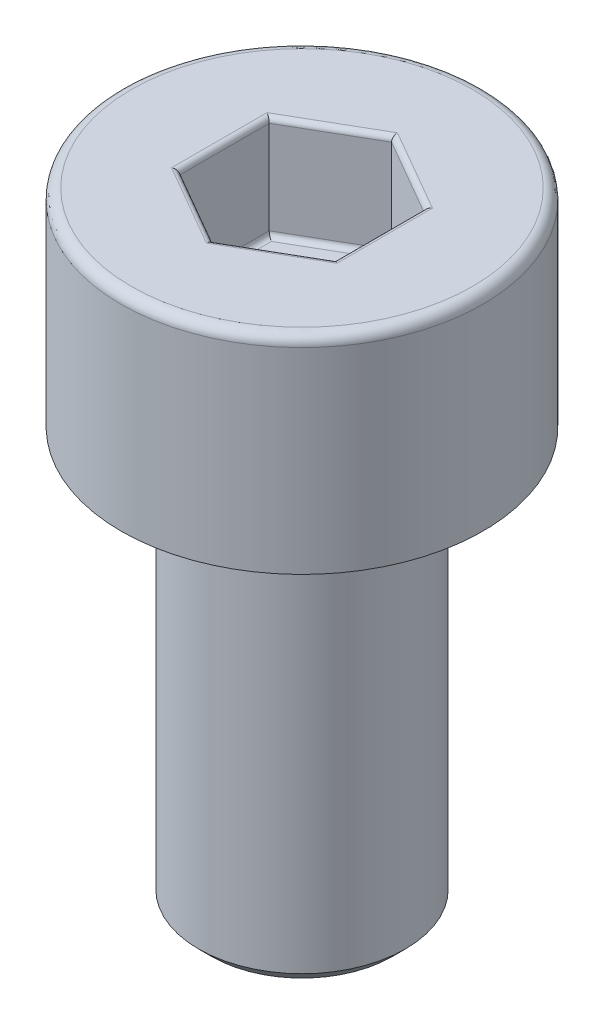
ISO-10303-21;
HEADER;
FILE_DESCRIPTION(('STEP AP214'),'2;1');
FILE_NAME('part.step','',(''),(''),'','','');
FILE_SCHEMA(('AUTOMOTIVE_DESIGN { 1 0 10303 214 1 1 1 1 }'));
ENDSEC;
DATA;
#1=APPLICATION_CONTEXT('core data for automotive mechanical design processes');
#2=APPLICATION_PROTOCOL_DEFINITION('international standard','automotive_design',2000,#1);
#3=PRODUCT_CONTEXT('',#1,'mechanical');
#4=PRODUCT('Part','Part','',(#3));
#5=PRODUCT_RELATED_PRODUCT_CATEGORY('part','',(#4));
#6=PRODUCT_DEFINITION_FORMATION('','',#4);
#7=PRODUCT_DEFINITION_CONTEXT('part definition',#1,'design');
#8=PRODUCT_DEFINITION('design','',#6,#7);
#9=PRODUCT_DEFINITION_SHAPE('','',#8);
#10=(LENGTH_UNIT() NAMED_UNIT(*) SI_UNIT(.MILLI.,.METRE.));
#11=(NAMED_UNIT(*) PLANE_ANGLE_UNIT() SI_UNIT($,.RADIAN.));
#12=(NAMED_UNIT(*) SI_UNIT($,.STERADIAN.) SOLID_ANGLE_UNIT());
#13=UNCERTAINTY_MEASURE_WITH_UNIT(LENGTH_MEASURE(1.E-05),#10,'distance_accuracy_value','');
#14=(GEOMETRIC_REPRESENTATION_CONTEXT(3) GLOBAL_UNCERTAINTY_ASSIGNED_CONTEXT((#13)) GLOBAL_UNIT_ASSIGNED_CONTEXT((#10,
#11,#12)) REPRESENTATION_CONTEXT('',''));
#15=CARTESIAN_POINT('',(0.,0.,0.));
#16=DIRECTION('',(0.,0.,1.));
#17=DIRECTION('',(1.,0.,0.));
#18=AXIS2_PLACEMENT_3D('',#15,#16,#17);
#19=CARTESIAN_POINT('',(0.,-12.,0.));
#20=DIRECTION('',(0.,-1.,0.));
#21=DIRECTION('',(0.,0.,-1.));
#22=AXIS2_PLACEMENT_3D('',#19,#20,#21);
#23=PLANE('',#22);
#24=CARTESIAN_POINT('',(0.,-12.,0.));
#25=DIRECTION('',(0.,-1.,0.));
#26=DIRECTION('',(0.,0.,-1.));
#27=AXIS2_PLACEMENT_3D('',#24,#25,#26);
#28=CIRCLE('',#27,1.74999999999999);
#29=CARTESIAN_POINT('',(0.,-12.,-1.74999999999999));
#30=VERTEX_POINT('',#29);
#31=EDGE_CURVE('E261',#30,#30,#28,.T.);
#32=ORIENTED_EDGE('',*,*,#31,.T.);
#33=EDGE_LOOP('',(#32));
#34=FACE_BOUND('',#33,.T.);
#35=ADVANCED_FACE('F33',(#34),#23,.T.);
#36=CARTESIAN_POINT('',(0.,0.,0.));
#37=DIRECTION('',(0.,1.,0.));
#38=DIRECTION('',(0.,0.,1.));
#39=AXIS2_PLACEMENT_3D('',#36,#37,#38);
#40=CYLINDRICAL_SURFACE('',#39,2.);
#41=CARTESIAN_POINT('',(0.,-4.24999999999999,0.));
#42=DIRECTION('',(0.,-1.,0.));
#43=DIRECTION('',(0.,0.,-1.));
#44=AXIS2_PLACEMENT_3D('',#41,#42,#43);
#45=CIRCLE('',#44,2.);
#46=CARTESIAN_POINT('',(0.,-4.24999999999999,-2.));
#47=VERTEX_POINT('',#46);
#48=EDGE_CURVE('E258',#47,#47,#45,.T.);
#49=ORIENTED_EDGE('',*,*,#48,.T.);
#50=EDGE_LOOP('',(#49));
#51=FACE_BOUND('',#50,.T.);
#52=CARTESIAN_POINT('',(0.,-11.75,0.));
#53=DIRECTION('',(0.,-1.,0.));
#54=DIRECTION('',(0.,0.,-1.));
#55=AXIS2_PLACEMENT_3D('',#52,#53,#54);
#56=CIRCLE('',#55,2.);
#57=CARTESIAN_POINT('',(0.,-11.75,-2.));
#58=VERTEX_POINT('',#57);
#59=EDGE_CURVE('E255',#58,#58,#56,.F.);
#60=ORIENTED_EDGE('',*,*,#59,.T.);
#61=EDGE_LOOP('',(#60));
#62=FACE_BOUND('',#61,.T.);
#63=ADVANCED_FACE('F287',(#51,#62),#40,.T.);
#64=CARTESIAN_POINT('',(-2.,-4.,0.));
#65=DIRECTION('',(0.,-1.,0.));
#66=DIRECTION('',(0.,0.,-1.));
#67=AXIS2_PLACEMENT_3D('',#64,#65,#66);
#68=PLANE('',#67);
#69=CARTESIAN_POINT('',(0.,-4.,0.));
#70=DIRECTION('',(0.,-1.,0.));
#71=DIRECTION('',(0.,0.,-1.));
#72=AXIS2_PLACEMENT_3D('',#69,#70,#71);
#73=CIRCLE('',#72,2.24999999999999);
#74=CARTESIAN_POINT('',(0.,-4.,-2.24999999999999));
#75=VERTEX_POINT('',#74);
#76=EDGE_CURVE('E252',#75,#75,#73,.F.);
#77=ORIENTED_EDGE('',*,*,#76,.T.);
#78=EDGE_LOOP('',(#77));
#79=FACE_BOUND('',#78,.T.);
#80=CARTESIAN_POINT('',(0.,-4.,0.));
#81=DIRECTION('',(0.,1.,0.));
#82=DIRECTION('',(0.,0.,1.));
#83=AXIS2_PLACEMENT_3D('',#80,#81,#82);
#84=CIRCLE('',#83,3.5);
#85=CARTESIAN_POINT('',(0.,-4.,3.5));
#86=VERTEX_POINT('',#85);
#87=EDGE_CURVE('E249',#86,#86,#84,.T.);
#88=ORIENTED_EDGE('',*,*,#87,.F.);
#89=EDGE_LOOP('',(#88));
#90=FACE_BOUND('',#89,.T.);
#91=ADVANCED_FACE('F293',(#79,#90),#68,.T.);
#92=CARTESIAN_POINT('',(0.,0.,0.));
#93=DIRECTION('',(0.,1.,0.));
#94=DIRECTION('',(0.,0.,1.));
#95=AXIS2_PLACEMENT_3D('',#92,#93,#94);
#96=CYLINDRICAL_SURFACE('',#95,3.5);
#97=CARTESIAN_POINT('',(0.,-0.2,0.));
#98=DIRECTION('',(0.,1.,0.));
#99=DIRECTION('',(0.,0.,1.));
#100=AXIS2_PLACEMENT_3D('',#97,#98,#99);
#101=CIRCLE('',#100,3.5);
#102=CARTESIAN_POINT('',(0.,-0.2,3.5));
#103=VERTEX_POINT('',#102);
#104=EDGE_CURVE('E159',#103,#103,#101,.F.);
#105=ORIENTED_EDGE('',*,*,#104,.T.);
#106=EDGE_LOOP('',(#105));
#107=FACE_BOUND('',#106,.T.);
#108=ORIENTED_EDGE('',*,*,#87,.T.);
#109=EDGE_LOOP('',(#108));
#110=FACE_BOUND('',#109,.T.);
#111=ADVANCED_FACE('F303',(#107,#110),#96,.T.);
#112=CARTESIAN_POINT('',(-3.5,0.,0.));
#113=DIRECTION('',(0.,1.,0.));
#114=DIRECTION('',(0.,0.,1.));
#115=AXIS2_PLACEMENT_3D('',#112,#113,#114);
#116=PLANE('',#115);
#117=DIRECTION('',(0.,0.,1.));
#118=VECTOR('',#117,1.);
#119=CARTESIAN_POINT('',(-1.6,0.,-0.86602540378444));
#120=LINE('',#119,#118);
#121=CARTESIAN_POINT('',(-1.6,0.,0.923760430703401));
#122=VERTEX_POINT('',#121);
#123=CARTESIAN_POINT('',(-1.6,0.,-0.923760430703403));
#124=VERTEX_POINT('',#123);
#125=EDGE_CURVE('E175',#122,#124,#120,.F.);
#126=ORIENTED_EDGE('',*,*,#125,.T.);
#127=DIRECTION('',(-0.866025403784439,0.,0.5));
#128=VECTOR('',#127,1.);
#129=CARTESIAN_POINT('',(-0.0499999999999999,0.,-1.81865334794732));
#130=LINE('',#129,#128);
#131=CARTESIAN_POINT('',(0.,0.,-1.8475208614068));
#132=VERTEX_POINT('',#131);
#133=EDGE_CURVE('E134',#124,#132,#130,.F.);
#134=ORIENTED_EDGE('',*,*,#133,.T.);
#135=DIRECTION('',(-0.866025403784439,0.,-0.5));
#136=VECTOR('',#135,1.);
#137=CARTESIAN_POINT('',(1.55,0.,-0.952627944162884));
#138=LINE('',#137,#136);
#139=CARTESIAN_POINT('',(1.6,0.,-0.923760430703403));
#140=VERTEX_POINT('',#139);
#141=EDGE_CURVE('E161',#132,#140,#138,.F.);
#142=ORIENTED_EDGE('',*,*,#141,.T.);
#143=DIRECTION('',(0.,0.,-1.));
#144=VECTOR('',#143,1.);
#145=CARTESIAN_POINT('',(1.6,0.,0.866025403784439));
#146=LINE('',#145,#144);
#147=CARTESIAN_POINT('',(1.6,0.,0.923760430703402));
#148=VERTEX_POINT('',#147);
#149=EDGE_CURVE('E169',#140,#148,#146,.F.);
#150=ORIENTED_EDGE('',*,*,#149,.T.);
#151=DIRECTION('',(0.866025403784439,0.,-0.5));
#152=VECTOR('',#151,1.);
#153=CARTESIAN_POINT('',(0.0499999999999988,0.,1.81865334794732));
#154=LINE('',#153,#152);
#155=CARTESIAN_POINT('',(0.,0.,1.8475208614068));
#156=VERTEX_POINT('',#155);
#157=EDGE_CURVE('E171',#148,#156,#154,.F.);
#158=ORIENTED_EDGE('',*,*,#157,.T.);
#159=DIRECTION('',(0.866025403784439,0.,0.5));
#160=VECTOR('',#159,1.);
#161=CARTESIAN_POINT('',(-1.55,0.,0.952627944162882));
#162=LINE('',#161,#160);
#163=EDGE_CURVE('E173',#156,#122,#162,.F.);
#164=ORIENTED_EDGE('',*,*,#163,.T.);
#165=EDGE_LOOP('',(#126,#134,#142,#150,#158,#164));
#166=FACE_BOUND('',#165,.T.);
#167=CARTESIAN_POINT('',(0.,0.,0.));
#168=DIRECTION('',(0.,1.,0.));
#169=DIRECTION('',(0.,0.,1.));
#170=AXIS2_PLACEMENT_3D('',#167,#168,#169);
#171=CIRCLE('',#170,3.3);
#172=CARTESIAN_POINT('',(0.,0.,3.3));
#173=VERTEX_POINT('',#172);
#174=EDGE_CURVE('E164',#173,#173,#171,.T.);
#175=ORIENTED_EDGE('',*,*,#174,.T.);
#176=EDGE_LOOP('',(#175));
#177=FACE_BOUND('',#176,.T.);
#178=ADVANCED_FACE('F266',(#166,#177),#116,.T.);
#179=CARTESIAN_POINT('',(0.,-4.,0.));
#180=DIRECTION('',(0.,1.,0.));
#181=DIRECTION('',(0.,0.,1.));
#182=AXIS2_PLACEMENT_3D('',#179,#180,#181);
#183=CONICAL_SURFACE('',#182,2.24999999999999,0.785398163397457);
#184=ORIENTED_EDGE('',*,*,#48,.F.);
#185=EDGE_LOOP('',(#184));
#186=FACE_BOUND('',#185,.T.);
#187=ORIENTED_EDGE('',*,*,#76,.F.);
#188=EDGE_LOOP('',(#187));
#189=FACE_BOUND('',#188,.T.);
#190=ADVANCED_FACE('F281',(#186,#189),#183,.T.);
#191=CARTESIAN_POINT('',(0.,-11.75,0.));
#192=DIRECTION('',(0.,1.,0.));
#193=DIRECTION('',(0.,0.,1.));
#194=AXIS2_PLACEMENT_3D('',#191,#192,#193);
#195=CONICAL_SURFACE('',#194,2.,0.785398163397453);
#196=ORIENTED_EDGE('',*,*,#31,.F.);
#197=EDGE_LOOP('',(#196));
#198=FACE_BOUND('',#197,.T.);
#199=ORIENTED_EDGE('',*,*,#59,.F.);
#200=EDGE_LOOP('',(#199));
#201=FACE_BOUND('',#200,.T.);
#202=ADVANCED_FACE('F271',(#198,#201),#195,.T.);
#203=CARTESIAN_POINT('',(0.,-0.2,0.));
#204=DIRECTION('',(0.,1.,0.));
#205=DIRECTION('',(0.,0.,1.));
#206=AXIS2_PLACEMENT_3D('',#203,#204,#205);
#207=TOROIDAL_SURFACE('',#206,3.3,0.2);
#208=ORIENTED_EDGE('',*,*,#104,.F.);
#209=EDGE_LOOP('',(#208));
#210=FACE_BOUND('',#209,.T.);
#211=ORIENTED_EDGE('',*,*,#174,.F.);
#212=EDGE_LOOP('',(#211));
#213=FACE_BOUND('',#212,.T.);
#214=ADVANCED_FACE('F268',(#210,#213),#207,.T.);
#215=CARTESIAN_POINT('',(1.5,-2.,-0.86602540378444));
#216=DIRECTION('',(0.5,0.,-0.866025403784439));
#217=DIRECTION('',(-0.866025403784439,0.,-0.5));
#218=AXIS2_PLACEMENT_3D('',#215,#216,#217);
#219=PLANE('',#218);
#220=DIRECTION('',(0.,1.,0.));
#221=VECTOR('',#220,1.);
#222=CARTESIAN_POINT('',(1.5,-2.,-0.86602540378444));
#223=LINE('',#222,#221);
#224=CARTESIAN_POINT('',(1.5,-1.9,-0.86602540378444));
#225=VERTEX_POINT('',#224);
#226=CARTESIAN_POINT('',(1.5,-0.1,-0.86602540378444));
#227=VERTEX_POINT('',#226);
#228=EDGE_CURVE('E243',#225,#227,#223,.T.);
#229=ORIENTED_EDGE('',*,*,#228,.T.);
#230=DIRECTION('',(-0.866025403784439,0.,-0.5));
#231=VECTOR('',#230,1.);
#232=CARTESIAN_POINT('',(0.,-0.1,-1.73205080756888));
#233=LINE('',#232,#231);
#234=CARTESIAN_POINT('',(0.,-0.1,-1.73205080756888));
#235=VERTEX_POINT('',#234);
#236=EDGE_CURVE('E195',#227,#235,#233,.T.);
#237=ORIENTED_EDGE('',*,*,#236,.T.);
#238=DIRECTION('',(0.,1.,0.));
#239=VECTOR('',#238,1.);
#240=CARTESIAN_POINT('',(0.,-2.,-1.73205080756888));
#241=LINE('',#240,#239);
#242=CARTESIAN_POINT('',(0.,-1.9,-1.73205080756888));
#243=VERTEX_POINT('',#242);
#244=EDGE_CURVE('E145',#243,#235,#241,.T.);
#245=ORIENTED_EDGE('',*,*,#244,.F.);
#246=DIRECTION('',(-0.866025403784439,0.,-0.5));
#247=VECTOR('',#246,1.);
#248=CARTESIAN_POINT('',(1.5,-1.9,-0.86602540378444));
#249=LINE('',#248,#247);
#250=EDGE_CURVE('E193',#243,#225,#249,.F.);
#251=ORIENTED_EDGE('',*,*,#250,.T.);
#252=EDGE_LOOP('',(#229,#237,#245,#251));
#253=FACE_BOUND('',#252,.T.);
#254=ADVANCED_FACE('F270',(#253),#219,.F.);
#255=CARTESIAN_POINT('',(1.5,-2.,0.866025403784439));
#256=DIRECTION('',(1.,0.,0.));
#257=DIRECTION('',(0.,0.,-1.));
#258=AXIS2_PLACEMENT_3D('',#255,#256,#257);
#259=PLANE('',#258);
#260=DIRECTION('',(0.,1.,0.));
#261=VECTOR('',#260,1.);
#262=CARTESIAN_POINT('',(1.5,-2.,0.866025403784439));
#263=LINE('',#262,#261);
#264=CARTESIAN_POINT('',(1.5,-1.9,0.866025403784439));
#265=VERTEX_POINT('',#264);
#266=CARTESIAN_POINT('',(1.5,-0.1,0.866025403784439));
#267=VERTEX_POINT('',#266);
#268=EDGE_CURVE('E240',#265,#267,#263,.T.);
#269=ORIENTED_EDGE('',*,*,#268,.T.);
#270=DIRECTION('',(0.,0.,-1.));
#271=VECTOR('',#270,1.);
#272=CARTESIAN_POINT('',(1.5,-0.1,-0.86602540378444));
#273=LINE('',#272,#271);
#274=EDGE_CURVE('E191',#267,#227,#273,.T.);
#275=ORIENTED_EDGE('',*,*,#274,.T.);
#276=ORIENTED_EDGE('',*,*,#228,.F.);
#277=DIRECTION('',(0.,0.,-1.));
#278=VECTOR('',#277,1.);
#279=CARTESIAN_POINT('',(1.5,-1.9,0.866025403784439));
#280=LINE('',#279,#278);
#281=EDGE_CURVE('E188',#225,#265,#280,.F.);
#282=ORIENTED_EDGE('',*,*,#281,.T.);
#283=EDGE_LOOP('',(#269,#275,#276,#282));
#284=FACE_BOUND('',#283,.T.);
#285=ADVANCED_FACE('F278',(#284),#259,.F.);
#286=CARTESIAN_POINT('',(0.,-2.,1.73205080756888));
#287=DIRECTION('',(0.5,0.,0.866025403784439));
#288=DIRECTION('',(0.866025403784439,0.,-0.5));
#289=AXIS2_PLACEMENT_3D('',#286,#287,#288);
#290=PLANE('',#289);
#291=DIRECTION('',(0.,1.,0.));
#292=VECTOR('',#291,1.);
#293=CARTESIAN_POINT('',(0.,-2.,1.73205080756888));
#294=LINE('',#293,#292);
#295=CARTESIAN_POINT('',(0.,-1.9,1.73205080756888));
#296=VERTEX_POINT('',#295);
#297=CARTESIAN_POINT('',(0.,-0.1,1.73205080756888));
#298=VERTEX_POINT('',#297);
#299=EDGE_CURVE('E237',#296,#298,#294,.T.);
#300=ORIENTED_EDGE('',*,*,#299,.T.);
#301=DIRECTION('',(0.866025403784439,0.,-0.5));
#302=VECTOR('',#301,1.);
#303=CARTESIAN_POINT('',(1.5,-0.1,0.866025403784439));
#304=LINE('',#303,#302);
#305=EDGE_CURVE('E186',#298,#267,#304,.T.);
#306=ORIENTED_EDGE('',*,*,#305,.T.);
#307=ORIENTED_EDGE('',*,*,#268,.F.);
#308=DIRECTION('',(0.866025403784439,0.,-0.5));
#309=VECTOR('',#308,1.);
#310=CARTESIAN_POINT('',(0.,-1.9,1.73205080756888));
#311=LINE('',#310,#309);
#312=EDGE_CURVE('E184',#265,#296,#311,.F.);
#313=ORIENTED_EDGE('',*,*,#312,.T.);
#314=EDGE_LOOP('',(#300,#306,#307,#313));
#315=FACE_BOUND('',#314,.T.);
#316=ADVANCED_FACE('F327',(#315),#290,.F.);
#317=CARTESIAN_POINT('',(-1.5,-2.,0.866025403784438));
#318=DIRECTION('',(-0.5,0.,0.866025403784439));
#319=DIRECTION('',(0.866025403784439,0.,0.5));
#320=AXIS2_PLACEMENT_3D('',#317,#318,#319);
#321=PLANE('',#320);
#322=DIRECTION('',(0.,1.,0.));
#323=VECTOR('',#322,1.);
#324=CARTESIAN_POINT('',(-1.5,-2.,0.866025403784438));
#325=LINE('',#324,#323);
#326=CARTESIAN_POINT('',(-1.5,-1.9,0.866025403784438));
#327=VERTEX_POINT('',#326);
#328=CARTESIAN_POINT('',(-1.5,-0.1,0.866025403784438));
#329=VERTEX_POINT('',#328);
#330=EDGE_CURVE('E128',#327,#329,#325,.T.);
#331=ORIENTED_EDGE('',*,*,#330,.T.);
#332=DIRECTION('',(0.866025403784439,0.,0.5));
#333=VECTOR('',#332,1.);
#334=CARTESIAN_POINT('',(0.,-0.1,1.73205080756888));
#335=LINE('',#334,#333);
#336=EDGE_CURVE('E182',#329,#298,#335,.T.);
#337=ORIENTED_EDGE('',*,*,#336,.T.);
#338=ORIENTED_EDGE('',*,*,#299,.F.);
#339=DIRECTION('',(0.866025403784439,0.,0.5));
#340=VECTOR('',#339,1.);
#341=CARTESIAN_POINT('',(-1.5,-1.9,0.866025403784438));
#342=LINE('',#341,#340);
#343=EDGE_CURVE('E180',#296,#327,#342,.F.);
#344=ORIENTED_EDGE('',*,*,#343,.T.);
#345=EDGE_LOOP('',(#331,#337,#338,#344));
#346=FACE_BOUND('',#345,.T.);
#347=ADVANCED_FACE('F234',(#346),#321,.F.);
#348=CARTESIAN_POINT('',(-1.5,-2.,-0.86602540378444));
#349=DIRECTION('',(-1.,0.,0.));
#350=DIRECTION('',(0.,0.,1.));
#351=AXIS2_PLACEMENT_3D('',#348,#349,#350);
#352=PLANE('',#351);
#353=DIRECTION('',(0.,1.,0.));
#354=VECTOR('',#353,1.);
#355=CARTESIAN_POINT('',(-1.5,-2.,-0.86602540378444));
#356=LINE('',#355,#354);
#357=CARTESIAN_POINT('',(-1.5,-1.9,-0.86602540378444));
#358=VERTEX_POINT('',#357);
#359=CARTESIAN_POINT('',(-1.5,-0.1,-0.86602540378444));
#360=VERTEX_POINT('',#359);
#361=EDGE_CURVE('E126',#358,#360,#356,.T.);
#362=ORIENTED_EDGE('',*,*,#361,.T.);
#363=DIRECTION('',(0.,0.,1.));
#364=VECTOR('',#363,1.);
#365=CARTESIAN_POINT('',(-1.5,-0.1,0.866025403784438));
#366=LINE('',#365,#364);
#367=EDGE_CURVE('E133',#360,#329,#366,.T.);
#368=ORIENTED_EDGE('',*,*,#367,.T.);
#369=ORIENTED_EDGE('',*,*,#330,.F.);
#370=DIRECTION('',(0.,0.,1.));
#371=VECTOR('',#370,1.);
#372=CARTESIAN_POINT('',(-1.5,-1.9,-0.86602540378444));
#373=LINE('',#372,#371);
#374=EDGE_CURVE('E123',#327,#358,#373,.F.);
#375=ORIENTED_EDGE('',*,*,#374,.T.);
#376=EDGE_LOOP('',(#362,#368,#369,#375));
#377=FACE_BOUND('',#376,.T.);
#378=ADVANCED_FACE('F125',(#377),#352,.F.);
#379=CARTESIAN_POINT('',(0.,-2.,-1.73205080756888));
#380=DIRECTION('',(-0.5,0.,-0.866025403784439));
#381=DIRECTION('',(-0.866025403784439,0.,0.5));
#382=AXIS2_PLACEMENT_3D('',#379,#380,#381);
#383=PLANE('',#382);
#384=ORIENTED_EDGE('',*,*,#244,.T.);
#385=DIRECTION('',(-0.866025403784439,0.,0.5));
#386=VECTOR('',#385,1.);
#387=CARTESIAN_POINT('',(-1.5,-0.1,-0.86602540378444));
#388=LINE('',#387,#386);
#389=EDGE_CURVE('E144',#235,#360,#388,.T.);
#390=ORIENTED_EDGE('',*,*,#389,.T.);
#391=ORIENTED_EDGE('',*,*,#361,.F.);
#392=DIRECTION('',(-0.866025403784439,0.,0.5));
#393=VECTOR('',#392,1.);
#394=CARTESIAN_POINT('',(0.,-1.9,-1.73205080756888));
#395=LINE('',#394,#393);
#396=EDGE_CURVE('E141',#358,#243,#395,.F.);
#397=ORIENTED_EDGE('',*,*,#396,.T.);
#398=EDGE_LOOP('',(#384,#390,#391,#397));
#399=FACE_BOUND('',#398,.T.);
#400=ADVANCED_FACE('F139',(#399),#383,.F.);
#401=CARTESIAN_POINT('',(1.5,-2.,-0.86602540378444));
#402=DIRECTION('',(0.,-1.,0.));
#403=DIRECTION('',(0.,0.,-1.));
#404=AXIS2_PLACEMENT_3D('',#401,#402,#403);
#405=PLANE('',#404);
#406=DIRECTION('',(0.866025403784439,0.,-0.5));
#407=VECTOR('',#406,1.);
#408=CARTESIAN_POINT('',(1.45,-2.,0.779422863405995));
#409=LINE('',#408,#407);
#410=CARTESIAN_POINT('',(0.,-2.,1.61658075373095));
#411=VERTEX_POINT('',#410);
#412=CARTESIAN_POINT('',(1.4,-2.,0.808290376865476));
#413=VERTEX_POINT('',#412);
#414=EDGE_CURVE('E42',#411,#413,#409,.T.);
#415=ORIENTED_EDGE('',*,*,#414,.T.);
#416=DIRECTION('',(0.,0.,-1.));
#417=VECTOR('',#416,1.);
#418=CARTESIAN_POINT('',(1.4,-2.,-0.86602540378444));
#419=LINE('',#418,#417);
#420=CARTESIAN_POINT('',(1.4,-2.,-0.808290376865478));
#421=VERTEX_POINT('',#420);
#422=EDGE_CURVE('E11',#413,#421,#419,.T.);
#423=ORIENTED_EDGE('',*,*,#422,.T.);
#424=DIRECTION('',(-0.866025403784439,0.,-0.5));
#425=VECTOR('',#424,1.);
#426=CARTESIAN_POINT('',(-0.0500000000000001,-2.,-1.64544826719043));
#427=LINE('',#426,#425);
#428=CARTESIAN_POINT('',(0.,-2.,-1.61658075373095));
#429=VERTEX_POINT('',#428);
#430=EDGE_CURVE('E197',#421,#429,#427,.T.);
#431=ORIENTED_EDGE('',*,*,#430,.T.);
#432=DIRECTION('',(-0.866025403784439,0.,0.5));
#433=VECTOR('',#432,1.);
#434=CARTESIAN_POINT('',(-1.45,-2.,-0.779422863405997));
#435=LINE('',#434,#433);
#436=CARTESIAN_POINT('',(-1.4,-2.,-0.808290376865478));
#437=VERTEX_POINT('',#436);
#438=EDGE_CURVE('E199',#429,#437,#435,.T.);
#439=ORIENTED_EDGE('',*,*,#438,.T.);
#440=DIRECTION('',(0.,0.,1.));
#441=VECTOR('',#440,1.);
#442=CARTESIAN_POINT('',(-1.4,-2.,0.866025403784438));
#443=LINE('',#442,#441);
#444=CARTESIAN_POINT('',(-1.4,-2.,0.808290376865476));
#445=VERTEX_POINT('',#444);
#446=EDGE_CURVE('E150',#437,#445,#443,.T.);
#447=ORIENTED_EDGE('',*,*,#446,.T.);
#448=DIRECTION('',(0.866025403784439,0.,0.5));
#449=VECTOR('',#448,1.);
#450=CARTESIAN_POINT('',(0.0499999999999989,-2.,1.64544826719043));
#451=LINE('',#450,#449);
#452=EDGE_CURVE('E53',#445,#411,#451,.T.);
#453=ORIENTED_EDGE('',*,*,#452,.T.);
#454=EDGE_LOOP('',(#415,#423,#431,#439,#447,#453));
#455=FACE_BOUND('',#454,.T.);
#456=ADVANCED_FACE('F322',(#455),#405,.F.);
#457=CARTESIAN_POINT('',(0.0499999999999988,-0.1,1.81865334794732));
#458=DIRECTION('',(-0.866025403784439,0.,0.5));
#459=DIRECTION('',(0.5,0.,0.866025403784439));
#460=AXIS2_PLACEMENT_3D('',#457,#458,#459);
#461=CYLINDRICAL_SURFACE('',#460,0.1);
#462=CARTESIAN_POINT('',(0.,-0.1,1.8475208614068));
#463=DIRECTION('',(-1.,0.,0.));
#464=DIRECTION('',(0.,0.,-1.));
#465=AXIS2_PLACEMENT_3D('',#462,#463,#464);
#466=ELLIPSE('',#465,0.115470053837925,0.1);
#467=EDGE_CURVE('E214',#156,#298,#466,.T.);
#468=ORIENTED_EDGE('',*,*,#467,.F.);
#469=ORIENTED_EDGE('',*,*,#157,.F.);
#470=CARTESIAN_POINT('',(1.6,-0.1,0.923760430703402));
#471=DIRECTION('',(-0.5,0.,0.866025403784439));
#472=DIRECTION('',(-0.866025403784439,0.,-0.5));
#473=AXIS2_PLACEMENT_3D('',#470,#471,#472);
#474=ELLIPSE('',#473,0.115470053837925,0.1);
#475=EDGE_CURVE('E217',#267,#148,#474,.F.);
#476=ORIENTED_EDGE('',*,*,#475,.F.);
#477=ORIENTED_EDGE('',*,*,#305,.F.);
#478=EDGE_LOOP('',(#468,#469,#476,#477));
#479=FACE_BOUND('',#478,.T.);
#480=ADVANCED_FACE('F334',(#479),#461,.T.);
#481=CARTESIAN_POINT('',(1.6,-0.1,0.866025403784439));
#482=DIRECTION('',(0.,0.,1.));
#483=DIRECTION('',(1.,0.,0.));
#484=AXIS2_PLACEMENT_3D('',#481,#482,#483);
#485=CYLINDRICAL_SURFACE('',#484,0.1);
#486=ORIENTED_EDGE('',*,*,#475,.T.);
#487=ORIENTED_EDGE('',*,*,#149,.F.);
#488=CARTESIAN_POINT('',(1.6,-0.1,-0.923760430703402));
#489=DIRECTION('',(0.5,0.,0.866025403784439));
#490=DIRECTION('',(-0.866025403784439,0.,0.5));
#491=AXIS2_PLACEMENT_3D('',#488,#489,#490);
#492=ELLIPSE('',#491,0.115470053837925,0.1);
#493=EDGE_CURVE('E211',#227,#140,#492,.F.);
#494=ORIENTED_EDGE('',*,*,#493,.F.);
#495=ORIENTED_EDGE('',*,*,#274,.F.);
#496=EDGE_LOOP('',(#486,#487,#494,#495));
#497=FACE_BOUND('',#496,.T.);
#498=ADVANCED_FACE('F338',(#497),#485,.T.);
#499=CARTESIAN_POINT('',(-1.55,-0.1,0.952627944162882));
#500=DIRECTION('',(-0.866025403784439,0.,-0.5));
#501=DIRECTION('',(-0.5,0.,0.866025403784439));
#502=AXIS2_PLACEMENT_3D('',#499,#500,#501);
#503=CYLINDRICAL_SURFACE('',#502,0.1);
#504=ORIENTED_EDGE('',*,*,#467,.T.);
#505=ORIENTED_EDGE('',*,*,#336,.F.);
#506=CARTESIAN_POINT('',(-1.6,-0.1,0.923760430703401));
#507=DIRECTION('',(-0.5,0.,-0.866025403784439));
#508=DIRECTION('',(0.866025403784439,0.,-0.5));
#509=AXIS2_PLACEMENT_3D('',#506,#507,#508);
#510=ELLIPSE('',#509,0.115470053837925,0.1);
#511=EDGE_CURVE('E208',#122,#329,#510,.T.);
#512=ORIENTED_EDGE('',*,*,#511,.F.);
#513=ORIENTED_EDGE('',*,*,#163,.F.);
#514=EDGE_LOOP('',(#504,#505,#512,#513));
#515=FACE_BOUND('',#514,.T.);
#516=ADVANCED_FACE('F344',(#515),#503,.T.);
#517=CARTESIAN_POINT('',(1.55,-0.1,-0.952627944162884));
#518=DIRECTION('',(0.866025403784439,0.,0.5));
#519=DIRECTION('',(0.5,0.,-0.866025403784439));
#520=AXIS2_PLACEMENT_3D('',#517,#518,#519);
#521=CYLINDRICAL_SURFACE('',#520,0.1);
#522=ORIENTED_EDGE('',*,*,#493,.T.);
#523=ORIENTED_EDGE('',*,*,#141,.F.);
#524=CARTESIAN_POINT('',(0.,-0.1,-1.8475208614068));
#525=DIRECTION('',(1.,0.,0.));
#526=DIRECTION('',(0.,0.,-1.));
#527=AXIS2_PLACEMENT_3D('',#524,#525,#526);
#528=ELLIPSE('',#527,0.115470053837925,0.1);
#529=EDGE_CURVE('E206',#235,#132,#528,.F.);
#530=ORIENTED_EDGE('',*,*,#529,.F.);
#531=ORIENTED_EDGE('',*,*,#236,.F.);
#532=EDGE_LOOP('',(#522,#523,#530,#531));
#533=FACE_BOUND('',#532,.T.);
#534=ADVANCED_FACE('F374',(#533),#521,.T.);
#535=CARTESIAN_POINT('',(-1.6,-0.1,-0.86602540378444));
#536=DIRECTION('',(0.,0.,-1.));
#537=DIRECTION('',(-1.,0.,0.));
#538=AXIS2_PLACEMENT_3D('',#535,#536,#537);
#539=CYLINDRICAL_SURFACE('',#538,0.1);
#540=ORIENTED_EDGE('',*,*,#511,.T.);
#541=ORIENTED_EDGE('',*,*,#367,.F.);
#542=CARTESIAN_POINT('',(-1.6,-0.1,-0.923760430703403));
#543=DIRECTION('',(0.5,0.,-0.866025403784439));
#544=DIRECTION('',(0.866025403784439,0.,0.5));
#545=AXIS2_PLACEMENT_3D('',#542,#543,#544);
#546=ELLIPSE('',#545,0.115470053837925,0.1);
#547=EDGE_CURVE('E204',#124,#360,#546,.T.);
#548=ORIENTED_EDGE('',*,*,#547,.F.);
#549=ORIENTED_EDGE('',*,*,#125,.F.);
#550=EDGE_LOOP('',(#540,#541,#548,#549));
#551=FACE_BOUND('',#550,.T.);
#552=ADVANCED_FACE('F369',(#551),#539,.T.);
#553=CARTESIAN_POINT('',(-0.05,-0.1,-1.81865334794732));
#554=DIRECTION('',(0.866025403784439,0.,-0.5));
#555=DIRECTION('',(-0.5,0.,-0.866025403784439));
#556=AXIS2_PLACEMENT_3D('',#553,#554,#555);
#557=CYLINDRICAL_SURFACE('',#556,0.1);
#558=ORIENTED_EDGE('',*,*,#529,.T.);
#559=ORIENTED_EDGE('',*,*,#133,.F.);
#560=ORIENTED_EDGE('',*,*,#547,.T.);
#561=ORIENTED_EDGE('',*,*,#389,.F.);
#562=EDGE_LOOP('',(#558,#559,#560,#561));
#563=FACE_BOUND('',#562,.T.);
#564=ADVANCED_FACE('F365',(#563),#557,.T.);
#565=CARTESIAN_POINT('',(-1.4,-1.9,-0.86602540378444));
#566=DIRECTION('',(0.,0.,-1.));
#567=DIRECTION('',(-1.,0.,0.));
#568=AXIS2_PLACEMENT_3D('',#565,#566,#567);
#569=CYLINDRICAL_SURFACE('',#568,0.1);
#570=CARTESIAN_POINT('',(-1.4,-1.9,-0.808290376865478));
#571=DIRECTION('',(0.5,0.,-0.866025403784439));
#572=DIRECTION('',(-0.866025403784439,0.,-0.5));
#573=AXIS2_PLACEMENT_3D('',#570,#571,#572);
#574=ELLIPSE('',#573,0.115470053837925,0.1);
#575=EDGE_CURVE('E149',#358,#437,#574,.F.);
#576=ORIENTED_EDGE('',*,*,#575,.F.);
#577=ORIENTED_EDGE('',*,*,#374,.F.);
#578=CARTESIAN_POINT('',(-1.4,-1.9,0.808290376865476));
#579=DIRECTION('',(-0.5,0.,-0.866025403784439));
#580=DIRECTION('',(-0.866025403784439,0.,0.5));
#581=AXIS2_PLACEMENT_3D('',#578,#579,#580);
#582=ELLIPSE('',#581,0.115470053837925,0.1);
#583=EDGE_CURVE('E37',#445,#327,#582,.T.);
#584=ORIENTED_EDGE('',*,*,#583,.F.);
#585=ORIENTED_EDGE('',*,*,#446,.F.);
#586=EDGE_LOOP('',(#576,#577,#584,#585));
#587=FACE_BOUND('',#586,.T.);
#588=ADVANCED_FACE('F35',(#587),#569,.F.);
#589=CARTESIAN_POINT('',(0.0499999999999984,-1.9,1.64544826719043));
#590=DIRECTION('',(-0.866025403784439,0.,-0.5));
#591=DIRECTION('',(-0.5,0.,0.866025403784439));
#592=AXIS2_PLACEMENT_3D('',#589,#590,#591);
#593=CYLINDRICAL_SURFACE('',#592,0.1);
#594=ORIENTED_EDGE('',*,*,#583,.T.);
#595=ORIENTED_EDGE('',*,*,#343,.F.);
#596=CARTESIAN_POINT('',(0.,-1.9,1.61658075373095));
#597=DIRECTION('',(-1.,0.,0.));
#598=DIRECTION('',(0.,0.,1.));
#599=AXIS2_PLACEMENT_3D('',#596,#597,#598);
#600=ELLIPSE('',#599,0.115470053837925,0.1);
#601=EDGE_CURVE('E153',#411,#296,#600,.T.);
#602=ORIENTED_EDGE('',*,*,#601,.F.);
#603=ORIENTED_EDGE('',*,*,#452,.F.);
#604=EDGE_LOOP('',(#594,#595,#602,#603));
#605=FACE_BOUND('',#604,.T.);
#606=ADVANCED_FACE('F231',(#605),#593,.F.);
#607=CARTESIAN_POINT('',(0.8,-1.9,-2.07846096908265));
#608=DIRECTION('',(0.866025403784439,0.,-0.5));
#609=DIRECTION('',(-0.5,0.,-0.866025403784439));
#610=AXIS2_PLACEMENT_3D('',#607,#608,#609);
#611=CYLINDRICAL_SURFACE('',#610,0.1);
#612=ORIENTED_EDGE('',*,*,#575,.T.);
#613=ORIENTED_EDGE('',*,*,#438,.F.);
#614=CARTESIAN_POINT('',(0.,-1.9,-1.61658075373095));
#615=DIRECTION('',(1.,0.,0.));
#616=DIRECTION('',(0.,0.,-1.));
#617=AXIS2_PLACEMENT_3D('',#614,#615,#616);
#618=ELLIPSE('',#617,0.115470053837925,0.1);
#619=EDGE_CURVE('E157',#243,#429,#618,.F.);
#620=ORIENTED_EDGE('',*,*,#619,.F.);
#621=ORIENTED_EDGE('',*,*,#396,.F.);
#622=EDGE_LOOP('',(#612,#613,#620,#621));
#623=FACE_BOUND('',#622,.T.);
#624=ADVANCED_FACE('F155',(#623),#611,.F.);
#625=CARTESIAN_POINT('',(2.2,-1.9,0.346410161513775));
#626=DIRECTION('',(-0.866025403784439,0.,0.5));
#627=DIRECTION('',(0.5,0.,0.866025403784439));
#628=AXIS2_PLACEMENT_3D('',#625,#626,#627);
#629=CYLINDRICAL_SURFACE('',#628,0.1);
#630=ORIENTED_EDGE('',*,*,#601,.T.);
#631=ORIENTED_EDGE('',*,*,#312,.F.);
#632=CARTESIAN_POINT('',(1.4,-1.9,0.808290376865476));
#633=DIRECTION('',(-0.5,0.,0.866025403784439));
#634=DIRECTION('',(0.866025403784439,0.,0.5));
#635=AXIS2_PLACEMENT_3D('',#632,#633,#634);
#636=ELLIPSE('',#635,0.115470053837925,0.1);
#637=EDGE_CURVE('E222',#413,#265,#636,.T.);
#638=ORIENTED_EDGE('',*,*,#637,.F.);
#639=ORIENTED_EDGE('',*,*,#414,.F.);
#640=EDGE_LOOP('',(#630,#631,#638,#639));
#641=FACE_BOUND('',#640,.T.);
#642=ADVANCED_FACE('F228',(#641),#629,.F.);
#643=CARTESIAN_POINT('',(1.45,-1.9,-0.779422863405997));
#644=DIRECTION('',(0.866025403784439,0.,0.5));
#645=DIRECTION('',(0.5,0.,-0.866025403784439));
#646=AXIS2_PLACEMENT_3D('',#643,#644,#645);
#647=CYLINDRICAL_SURFACE('',#646,0.1);
#648=ORIENTED_EDGE('',*,*,#619,.T.);
#649=ORIENTED_EDGE('',*,*,#430,.F.);
#650=CARTESIAN_POINT('',(1.4,-1.9,-0.808290376865478));
#651=DIRECTION('',(0.5,0.,0.866025403784439));
#652=DIRECTION('',(-0.866025403784439,0.,0.5));
#653=AXIS2_PLACEMENT_3D('',#650,#651,#652);
#654=ELLIPSE('',#653,0.115470053837925,0.1);
#655=EDGE_CURVE('E220',#225,#421,#654,.F.);
#656=ORIENTED_EDGE('',*,*,#655,.F.);
#657=ORIENTED_EDGE('',*,*,#250,.F.);
#658=EDGE_LOOP('',(#648,#649,#656,#657));
#659=FACE_BOUND('',#658,.T.);
#660=ADVANCED_FACE('F353',(#659),#647,.F.);
#661=CARTESIAN_POINT('',(1.4,-1.9,-0.86602540378444));
#662=DIRECTION('',(0.,0.,1.));
#663=DIRECTION('',(1.,0.,0.));
#664=AXIS2_PLACEMENT_3D('',#661,#662,#663);
#665=CYLINDRICAL_SURFACE('',#664,0.1);
#666=ORIENTED_EDGE('',*,*,#637,.T.);
#667=ORIENTED_EDGE('',*,*,#281,.F.);
#668=ORIENTED_EDGE('',*,*,#655,.T.);
#669=ORIENTED_EDGE('',*,*,#422,.F.);
#670=EDGE_LOOP('',(#666,#667,#668,#669));
#671=FACE_BOUND('',#670,.T.);
#672=ADVANCED_FACE('F350',(#671),#665,.F.);
#673=CLOSED_SHELL('',(#35,#63,#91,#111,#178,#190,#202,#214,#254,#285,#316,#347,#378,#400,#456,
#480,#498,#516,#534,#552,#564,#588,#606,#624,#642,#660,#672));
#674=MANIFOLD_SOLID_BREP('B2',#673);
#675=ADVANCED_BREP_SHAPE_REPRESENTATION('',(#18,#674),#14);
#676=SHAPE_DEFINITION_REPRESENTATION(#9,#675);
ENDSEC;
END-ISO-10303-21;
